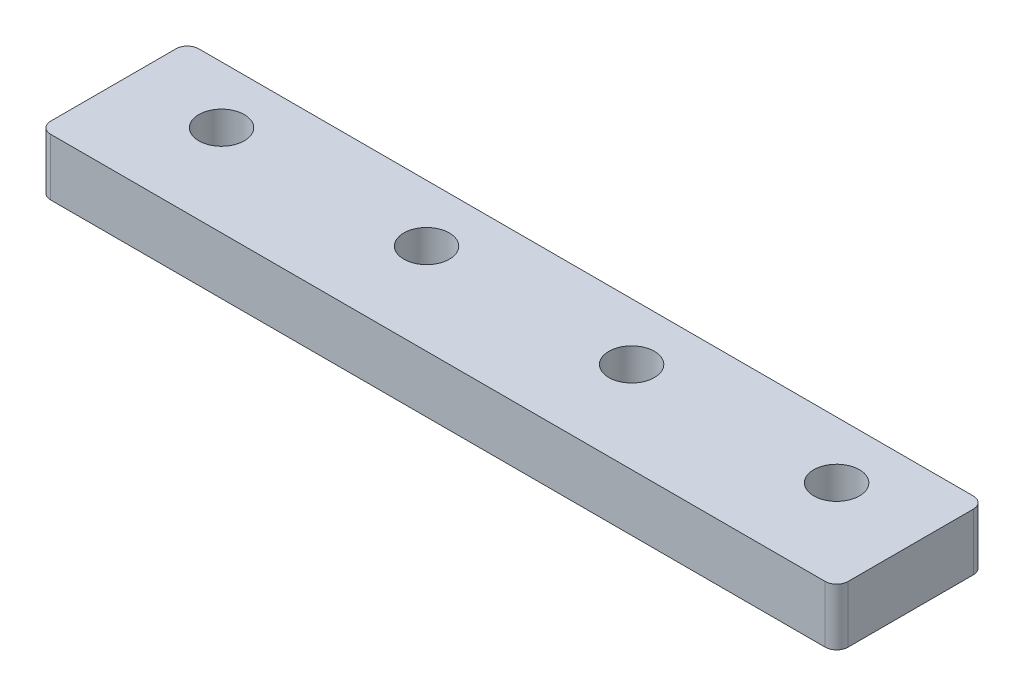
ISO-10303-21;
HEADER;
FILE_DESCRIPTION(('STEP AP214'),'2;1');
FILE_NAME('part.step','',(''),(''),'','','');
FILE_SCHEMA(('AUTOMOTIVE_DESIGN { 1 0 10303 214 1 1 1 1 }'));
ENDSEC;
DATA;
#1=APPLICATION_CONTEXT('core data for automotive mechanical design processes');
#2=APPLICATION_PROTOCOL_DEFINITION('international standard','automotive_design',2000,#1);
#3=PRODUCT_CONTEXT('',#1,'mechanical');
#4=PRODUCT('Part','Part','',(#3));
#5=PRODUCT_RELATED_PRODUCT_CATEGORY('part','',(#4));
#6=PRODUCT_DEFINITION_FORMATION('','',#4);
#7=PRODUCT_DEFINITION_CONTEXT('part definition',#1,'design');
#8=PRODUCT_DEFINITION('design','',#6,#7);
#9=PRODUCT_DEFINITION_SHAPE('','',#8);
#10=(LENGTH_UNIT() NAMED_UNIT(*) SI_UNIT(.MILLI.,.METRE.));
#11=(NAMED_UNIT(*) PLANE_ANGLE_UNIT() SI_UNIT($,.RADIAN.));
#12=(NAMED_UNIT(*) SI_UNIT($,.STERADIAN.) SOLID_ANGLE_UNIT());
#13=UNCERTAINTY_MEASURE_WITH_UNIT(LENGTH_MEASURE(1.E-05),#10,'distance_accuracy_value','');
#14=(GEOMETRIC_REPRESENTATION_CONTEXT(3) GLOBAL_UNCERTAINTY_ASSIGNED_CONTEXT((#13)) GLOBAL_UNIT_ASSIGNED_CONTEXT((#10,
#11,#12)) REPRESENTATION_CONTEXT('',''));
#15=CARTESIAN_POINT('',(0.,0.,0.));
#16=DIRECTION('',(0.,0.,1.));
#17=DIRECTION('',(1.,0.,0.));
#18=AXIS2_PLACEMENT_3D('',#15,#16,#17);
#19=CARTESIAN_POINT('',(0.,5.,0.));
#20=DIRECTION('',(0.,-1.,0.));
#21=DIRECTION('',(0.,0.,-1.));
#22=AXIS2_PLACEMENT_3D('',#19,#20,#21);
#23=PLANE('',#22);
#24=DIRECTION('',(0.,0.,1.));
#25=VECTOR('',#24,1.);
#26=CARTESIAN_POINT('',(-35.,5.,-5.));
#27=LINE('',#26,#25);
#28=CARTESIAN_POINT('',(-35.,5.,-3.99999999999999));
#29=VERTEX_POINT('',#28);
#30=CARTESIAN_POINT('',(-35.,5.,7.00000000000001));
#31=VERTEX_POINT('',#30);
#32=EDGE_CURVE('E180',#29,#31,#27,.T.);
#33=ORIENTED_EDGE('',*,*,#32,.T.);
#34=CARTESIAN_POINT('',(-34.,5.,7.));
#35=DIRECTION('',(0.,-1.,0.));
#36=DIRECTION('',(0.,0.,-1.));
#37=AXIS2_PLACEMENT_3D('',#34,#35,#36);
#38=CIRCLE('',#37,1.);
#39=CARTESIAN_POINT('',(-34.,5.,8.));
#40=VERTEX_POINT('',#39);
#41=EDGE_CURVE('E154',#31,#40,#38,.F.);
#42=ORIENTED_EDGE('',*,*,#41,.T.);
#43=DIRECTION('',(1.,0.,0.));
#44=VECTOR('',#43,1.);
#45=CARTESIAN_POINT('',(-35.,5.,8.));
#46=LINE('',#45,#44);
#47=CARTESIAN_POINT('',(34.,5.,8.));
#48=VERTEX_POINT('',#47);
#49=EDGE_CURVE('E127',#40,#48,#46,.T.);
#50=ORIENTED_EDGE('',*,*,#49,.T.);
#51=CARTESIAN_POINT('',(34.,5.,7.));
#52=DIRECTION('',(0.,-1.,0.));
#53=DIRECTION('',(0.,0.,-1.));
#54=AXIS2_PLACEMENT_3D('',#51,#52,#53);
#55=CIRCLE('',#54,1.);
#56=CARTESIAN_POINT('',(35.,5.,7.));
#57=VERTEX_POINT('',#56);
#58=EDGE_CURVE('E147',#48,#57,#55,.F.);
#59=ORIENTED_EDGE('',*,*,#58,.T.);
#60=DIRECTION('',(0.,0.,-1.));
#61=VECTOR('',#60,1.);
#62=CARTESIAN_POINT('',(35.,5.,8.));
#63=LINE('',#62,#61);
#64=CARTESIAN_POINT('',(34.9999999999999,5.,-4.));
#65=VERTEX_POINT('',#64);
#66=EDGE_CURVE('E132',#57,#65,#63,.T.);
#67=ORIENTED_EDGE('',*,*,#66,.T.);
#68=CARTESIAN_POINT('',(34.,5.,-4.));
#69=DIRECTION('',(0.,-1.,0.));
#70=DIRECTION('',(0.,0.,-1.));
#71=AXIS2_PLACEMENT_3D('',#68,#69,#70);
#72=CIRCLE('',#71,1.);
#73=CARTESIAN_POINT('',(34.,5.,-5.));
#74=VERTEX_POINT('',#73);
#75=EDGE_CURVE('E64',#65,#74,#72,.F.);
#76=ORIENTED_EDGE('',*,*,#75,.T.);
#77=DIRECTION('',(-1.,0.,0.));
#78=VECTOR('',#77,1.);
#79=CARTESIAN_POINT('',(-35.,5.,-5.));
#80=LINE('',#79,#78);
#81=CARTESIAN_POINT('',(-34.0000000000001,5.,-5.));
#82=VERTEX_POINT('',#81);
#83=EDGE_CURVE('E137',#74,#82,#80,.T.);
#84=ORIENTED_EDGE('',*,*,#83,.T.);
#85=CARTESIAN_POINT('',(-34.0000000000001,5.,-4.));
#86=DIRECTION('',(0.,-1.,0.));
#87=DIRECTION('',(0.,0.,-1.));
#88=AXIS2_PLACEMENT_3D('',#85,#86,#87);
#89=CIRCLE('',#88,1.);
#90=EDGE_CURVE('E153',#82,#29,#89,.F.);
#91=ORIENTED_EDGE('',*,*,#90,.T.);
#92=EDGE_LOOP('',(#33,#42,#50,#59,#67,#76,#84,#91));
#93=FACE_BOUND('',#92,.T.);
#94=CARTESIAN_POINT('',(-27.,5.,0.));
#95=DIRECTION('',(0.,1.,0.));
#96=DIRECTION('',(0.,0.,1.));
#97=AXIS2_PLACEMENT_3D('',#94,#95,#96);
#98=CIRCLE('',#97,2.);
#99=CARTESIAN_POINT('',(-27.,5.,2.));
#100=VERTEX_POINT('',#99);
#101=EDGE_CURVE('E173',#100,#100,#98,.T.);
#102=ORIENTED_EDGE('',*,*,#101,.F.);
#103=EDGE_LOOP('',(#102));
#104=FACE_BOUND('',#103,.T.);
#105=CARTESIAN_POINT('',(-8.99999999999999,5.,0.));
#106=DIRECTION('',(0.,1.,0.));
#107=DIRECTION('',(0.,0.,1.));
#108=AXIS2_PLACEMENT_3D('',#105,#106,#107);
#109=CIRCLE('',#108,2.);
#110=CARTESIAN_POINT('',(-8.99999999999999,5.,2.));
#111=VERTEX_POINT('',#110);
#112=EDGE_CURVE('E181',#111,#111,#109,.T.);
#113=ORIENTED_EDGE('',*,*,#112,.F.);
#114=EDGE_LOOP('',(#113));
#115=FACE_BOUND('',#114,.T.);
#116=CARTESIAN_POINT('',(9.00000000000001,5.,0.));
#117=DIRECTION('',(0.,1.,0.));
#118=DIRECTION('',(0.,0.,-1.));
#119=AXIS2_PLACEMENT_3D('',#116,#117,#118);
#120=CIRCLE('',#119,2.);
#121=CARTESIAN_POINT('',(9.00000000000001,5.,-2.));
#122=VERTEX_POINT('',#121);
#123=EDGE_CURVE('E187',#122,#122,#120,.T.);
#124=ORIENTED_EDGE('',*,*,#123,.F.);
#125=EDGE_LOOP('',(#124));
#126=FACE_BOUND('',#125,.T.);
#127=CARTESIAN_POINT('',(27.,5.,0.));
#128=DIRECTION('',(0.,1.,0.));
#129=DIRECTION('',(0.,0.,-1.));
#130=AXIS2_PLACEMENT_3D('',#127,#128,#129);
#131=CIRCLE('',#130,2.);
#132=CARTESIAN_POINT('',(27.,5.,-2.00000000000001));
#133=VERTEX_POINT('',#132);
#134=EDGE_CURVE('E191',#133,#133,#131,.T.);
#135=ORIENTED_EDGE('',*,*,#134,.F.);
#136=EDGE_LOOP('',(#135));
#137=FACE_BOUND('',#136,.T.);
#138=ADVANCED_FACE('F37',(#93,#104,#115,#126,#137),#23,.F.);
#139=CARTESIAN_POINT('',(0.,0.,0.));
#140=DIRECTION('',(0.,-1.,0.));
#141=DIRECTION('',(0.,0.,-1.));
#142=AXIS2_PLACEMENT_3D('',#139,#140,#141);
#143=PLANE('',#142);
#144=CARTESIAN_POINT('',(9.00000000000001,0.,0.));
#145=DIRECTION('',(0.,1.,0.));
#146=DIRECTION('',(0.,0.,-1.));
#147=AXIS2_PLACEMENT_3D('',#144,#145,#146);
#148=CIRCLE('',#147,2.);
#149=CARTESIAN_POINT('',(9.00000000000001,0.,-2.));
#150=VERTEX_POINT('',#149);
#151=EDGE_CURVE('E192',#150,#150,#148,.T.);
#152=ORIENTED_EDGE('',*,*,#151,.T.);
#153=EDGE_LOOP('',(#152));
#154=FACE_BOUND('',#153,.T.);
#155=CARTESIAN_POINT('',(-27.,0.,0.));
#156=DIRECTION('',(0.,1.,0.));
#157=DIRECTION('',(0.,0.,1.));
#158=AXIS2_PLACEMENT_3D('',#155,#156,#157);
#159=CIRCLE('',#158,2.);
#160=CARTESIAN_POINT('',(-27.,0.,2.));
#161=VERTEX_POINT('',#160);
#162=EDGE_CURVE('E175',#161,#161,#159,.T.);
#163=ORIENTED_EDGE('',*,*,#162,.T.);
#164=EDGE_LOOP('',(#163));
#165=FACE_BOUND('',#164,.T.);
#166=DIRECTION('',(1.,0.,0.));
#167=VECTOR('',#166,1.);
#168=CARTESIAN_POINT('',(-35.,0.,8.));
#169=LINE('',#168,#167);
#170=CARTESIAN_POINT('',(-34.,0.,8.));
#171=VERTEX_POINT('',#170);
#172=CARTESIAN_POINT('',(34.,0.,8.));
#173=VERTEX_POINT('',#172);
#174=EDGE_CURVE('E125',#171,#173,#169,.T.);
#175=ORIENTED_EDGE('',*,*,#174,.F.);
#176=CARTESIAN_POINT('',(-34.,0.,7.));
#177=DIRECTION('',(0.,-1.,0.));
#178=DIRECTION('',(0.,0.,-1.));
#179=AXIS2_PLACEMENT_3D('',#176,#177,#178);
#180=CIRCLE('',#179,1.);
#181=CARTESIAN_POINT('',(-35.,0.,7.00000000000001));
#182=VERTEX_POINT('',#181);
#183=EDGE_CURVE('E106',#171,#182,#180,.T.);
#184=ORIENTED_EDGE('',*,*,#183,.T.);
#185=DIRECTION('',(0.,0.,1.));
#186=VECTOR('',#185,1.);
#187=CARTESIAN_POINT('',(-35.,0.,5.));
#188=LINE('',#187,#186);
#189=CARTESIAN_POINT('',(-35.0000000000001,0.,-3.99999999999999));
#190=VERTEX_POINT('',#189);
#191=EDGE_CURVE('E135',#190,#182,#188,.T.);
#192=ORIENTED_EDGE('',*,*,#191,.F.);
#193=CARTESIAN_POINT('',(-34.0000000000001,0.,-4.));
#194=DIRECTION('',(0.,-1.,0.));
#195=DIRECTION('',(0.,0.,-1.));
#196=AXIS2_PLACEMENT_3D('',#193,#194,#195);
#197=CIRCLE('',#196,1.);
#198=CARTESIAN_POINT('',(-34.0000000000001,0.,-5.));
#199=VERTEX_POINT('',#198);
#200=EDGE_CURVE('E119',#190,#199,#197,.T.);
#201=ORIENTED_EDGE('',*,*,#200,.T.);
#202=DIRECTION('',(-1.,0.,0.));
#203=VECTOR('',#202,1.);
#204=CARTESIAN_POINT('',(-35.,0.,-5.));
#205=LINE('',#204,#203);
#206=CARTESIAN_POINT('',(34.,0.,-5.));
#207=VERTEX_POINT('',#206);
#208=EDGE_CURVE('E140',#207,#199,#205,.T.);
#209=ORIENTED_EDGE('',*,*,#208,.F.);
#210=CARTESIAN_POINT('',(34.,0.,-4.));
#211=DIRECTION('',(0.,-1.,0.));
#212=DIRECTION('',(0.,0.,-1.));
#213=AXIS2_PLACEMENT_3D('',#210,#211,#212);
#214=CIRCLE('',#213,1.);
#215=CARTESIAN_POINT('',(35.,0.,-4.));
#216=VERTEX_POINT('',#215);
#217=EDGE_CURVE('E145',#207,#216,#214,.T.);
#218=ORIENTED_EDGE('',*,*,#217,.T.);
#219=DIRECTION('',(0.,0.,-1.));
#220=VECTOR('',#219,1.);
#221=CARTESIAN_POINT('',(35.,0.,-5.));
#222=LINE('',#221,#220);
#223=CARTESIAN_POINT('',(35.,0.,7.));
#224=VERTEX_POINT('',#223);
#225=EDGE_CURVE('E167',#224,#216,#222,.T.);
#226=ORIENTED_EDGE('',*,*,#225,.F.);
#227=CARTESIAN_POINT('',(34.,0.,7.));
#228=DIRECTION('',(0.,-1.,0.));
#229=DIRECTION('',(0.,0.,-1.));
#230=AXIS2_PLACEMENT_3D('',#227,#228,#229);
#231=CIRCLE('',#230,1.);
#232=EDGE_CURVE('E130',#224,#173,#231,.T.);
#233=ORIENTED_EDGE('',*,*,#232,.T.);
#234=EDGE_LOOP('',(#175,#184,#192,#201,#209,#218,#226,#233));
#235=FACE_BOUND('',#234,.T.);
#236=CARTESIAN_POINT('',(-8.99999999999999,0.,0.));
#237=DIRECTION('',(0.,1.,0.));
#238=DIRECTION('',(0.,0.,1.));
#239=AXIS2_PLACEMENT_3D('',#236,#237,#238);
#240=CIRCLE('',#239,2.);
#241=CARTESIAN_POINT('',(-8.99999999999999,0.,2.));
#242=VERTEX_POINT('',#241);
#243=EDGE_CURVE('E183',#242,#242,#240,.T.);
#244=ORIENTED_EDGE('',*,*,#243,.T.);
#245=EDGE_LOOP('',(#244));
#246=FACE_BOUND('',#245,.T.);
#247=CARTESIAN_POINT('',(27.,0.,0.));
#248=DIRECTION('',(0.,1.,0.));
#249=DIRECTION('',(0.,0.,-1.));
#250=AXIS2_PLACEMENT_3D('',#247,#248,#249);
#251=CIRCLE('',#250,2.);
#252=CARTESIAN_POINT('',(27.,0.,-2.00000000000001));
#253=VERTEX_POINT('',#252);
#254=EDGE_CURVE('E197',#253,#253,#251,.T.);
#255=ORIENTED_EDGE('',*,*,#254,.T.);
#256=EDGE_LOOP('',(#255));
#257=FACE_BOUND('',#256,.T.);
#258=ADVANCED_FACE('F128',(#154,#165,#235,#246,#257),#143,.T.);
#259=CARTESIAN_POINT('',(35.,5.,-5.));
#260=DIRECTION('',(-1.,0.,0.));
#261=DIRECTION('',(0.,0.,1.));
#262=AXIS2_PLACEMENT_3D('',#259,#260,#261);
#263=PLANE('',#262);
#264=ORIENTED_EDGE('',*,*,#225,.T.);
#265=DIRECTION('',(0.,-1.,0.));
#266=VECTOR('',#265,1.);
#267=CARTESIAN_POINT('',(35.,5.,-4.));
#268=LINE('',#267,#266);
#269=EDGE_CURVE('E11',#216,#65,#268,.F.);
#270=ORIENTED_EDGE('',*,*,#269,.T.);
#271=ORIENTED_EDGE('',*,*,#66,.F.);
#272=DIRECTION('',(0.,-1.,0.));
#273=VECTOR('',#272,1.);
#274=CARTESIAN_POINT('',(35.,5.,7.));
#275=LINE('',#274,#273);
#276=EDGE_CURVE('E48',#57,#224,#275,.T.);
#277=ORIENTED_EDGE('',*,*,#276,.T.);
#278=EDGE_LOOP('',(#264,#270,#271,#277));
#279=FACE_BOUND('',#278,.T.);
#280=ADVANCED_FACE('F164',(#279),#263,.F.);
#281=CARTESIAN_POINT('',(-35.,5.,-5.));
#282=DIRECTION('',(0.,0.,1.));
#283=DIRECTION('',(1.,0.,0.));
#284=AXIS2_PLACEMENT_3D('',#281,#282,#283);
#285=PLANE('',#284);
#286=ORIENTED_EDGE('',*,*,#208,.T.);
#287=DIRECTION('',(0.,-1.,0.));
#288=VECTOR('',#287,1.);
#289=CARTESIAN_POINT('',(-34.0000000000001,5.,-5.));
#290=LINE('',#289,#288);
#291=EDGE_CURVE('E54',#199,#82,#290,.F.);
#292=ORIENTED_EDGE('',*,*,#291,.T.);
#293=ORIENTED_EDGE('',*,*,#83,.F.);
#294=DIRECTION('',(0.,-1.,0.));
#295=VECTOR('',#294,1.);
#296=CARTESIAN_POINT('',(34.,5.,-5.));
#297=LINE('',#296,#295);
#298=EDGE_CURVE('E160',#74,#207,#297,.T.);
#299=ORIENTED_EDGE('',*,*,#298,.T.);
#300=EDGE_LOOP('',(#286,#292,#293,#299));
#301=FACE_BOUND('',#300,.T.);
#302=ADVANCED_FACE('F221',(#301),#285,.F.);
#303=CARTESIAN_POINT('',(-35.,5.,5.));
#304=DIRECTION('',(1.,0.,0.));
#305=DIRECTION('',(0.,0.,-1.));
#306=AXIS2_PLACEMENT_3D('',#303,#304,#305);
#307=PLANE('',#306);
#308=ORIENTED_EDGE('',*,*,#191,.T.);
#309=DIRECTION('',(0.,-1.,0.));
#310=VECTOR('',#309,1.);
#311=CARTESIAN_POINT('',(-35.,5.,7.00000000000001));
#312=LINE('',#311,#310);
#313=EDGE_CURVE('E112',#182,#31,#312,.F.);
#314=ORIENTED_EDGE('',*,*,#313,.T.);
#315=ORIENTED_EDGE('',*,*,#32,.F.);
#316=DIRECTION('',(0.,-1.,0.));
#317=VECTOR('',#316,1.);
#318=CARTESIAN_POINT('',(-35.0000000000001,5.,-3.99999999999999));
#319=LINE('',#318,#317);
#320=EDGE_CURVE('E118',#29,#190,#319,.T.);
#321=ORIENTED_EDGE('',*,*,#320,.T.);
#322=EDGE_LOOP('',(#308,#314,#315,#321));
#323=FACE_BOUND('',#322,.T.);
#324=ADVANCED_FACE('F222',(#323),#307,.F.);
#325=CARTESIAN_POINT('',(-35.,5.,8.));
#326=DIRECTION('',(0.,0.,-1.));
#327=DIRECTION('',(-1.,0.,0.));
#328=AXIS2_PLACEMENT_3D('',#325,#326,#327);
#329=PLANE('',#328);
#330=ORIENTED_EDGE('',*,*,#49,.F.);
#331=DIRECTION('',(0.,-1.,0.));
#332=VECTOR('',#331,1.);
#333=CARTESIAN_POINT('',(-34.,5.,8.));
#334=LINE('',#333,#332);
#335=EDGE_CURVE('E109',#40,#171,#334,.T.);
#336=ORIENTED_EDGE('',*,*,#335,.T.);
#337=ORIENTED_EDGE('',*,*,#174,.T.);
#338=DIRECTION('',(0.,-1.,0.));
#339=VECTOR('',#338,1.);
#340=CARTESIAN_POINT('',(34.,5.,8.));
#341=LINE('',#340,#339);
#342=EDGE_CURVE('E126',#173,#48,#341,.F.);
#343=ORIENTED_EDGE('',*,*,#342,.T.);
#344=EDGE_LOOP('',(#330,#336,#337,#343));
#345=FACE_BOUND('',#344,.T.);
#346=ADVANCED_FACE('F124',(#345),#329,.F.);
#347=CARTESIAN_POINT('',(-27.,5.,0.));
#348=DIRECTION('',(0.,-1.,0.));
#349=DIRECTION('',(0.,0.,-1.));
#350=AXIS2_PLACEMENT_3D('',#347,#348,#349);
#351=CYLINDRICAL_SURFACE('',#350,2.);
#352=ORIENTED_EDGE('',*,*,#101,.T.);
#353=EDGE_LOOP('',(#352));
#354=FACE_BOUND('',#353,.T.);
#355=ORIENTED_EDGE('',*,*,#162,.F.);
#356=EDGE_LOOP('',(#355));
#357=FACE_BOUND('',#356,.T.);
#358=ADVANCED_FACE('F216',(#354,#357),#351,.F.);
#359=CARTESIAN_POINT('',(-8.99999999999999,5.,0.));
#360=DIRECTION('',(0.,-1.,0.));
#361=DIRECTION('',(0.,0.,-1.));
#362=AXIS2_PLACEMENT_3D('',#359,#360,#361);
#363=CYLINDRICAL_SURFACE('',#362,2.);
#364=ORIENTED_EDGE('',*,*,#112,.T.);
#365=EDGE_LOOP('',(#364));
#366=FACE_BOUND('',#365,.T.);
#367=ORIENTED_EDGE('',*,*,#243,.F.);
#368=EDGE_LOOP('',(#367));
#369=FACE_BOUND('',#368,.T.);
#370=ADVANCED_FACE('F283',(#366,#369),#363,.F.);
#371=CARTESIAN_POINT('',(9.00000000000001,5.,0.));
#372=DIRECTION('',(0.,-1.,0.));
#373=DIRECTION('',(0.,0.,-1.));
#374=AXIS2_PLACEMENT_3D('',#371,#372,#373);
#375=CYLINDRICAL_SURFACE('',#374,2.);
#376=ORIENTED_EDGE('',*,*,#123,.T.);
#377=EDGE_LOOP('',(#376));
#378=FACE_BOUND('',#377,.T.);
#379=ORIENTED_EDGE('',*,*,#151,.F.);
#380=EDGE_LOOP('',(#379));
#381=FACE_BOUND('',#380,.T.);
#382=ADVANCED_FACE('F275',(#378,#381),#375,.F.);
#383=CARTESIAN_POINT('',(27.,5.,0.));
#384=DIRECTION('',(0.,-1.,0.));
#385=DIRECTION('',(0.,0.,-1.));
#386=AXIS2_PLACEMENT_3D('',#383,#384,#385);
#387=CYLINDRICAL_SURFACE('',#386,2.);
#388=ORIENTED_EDGE('',*,*,#134,.T.);
#389=EDGE_LOOP('',(#388));
#390=FACE_BOUND('',#389,.T.);
#391=ORIENTED_EDGE('',*,*,#254,.F.);
#392=EDGE_LOOP('',(#391));
#393=FACE_BOUND('',#392,.T.);
#394=ADVANCED_FACE('F201',(#390,#393),#387,.F.);
#395=CARTESIAN_POINT('',(-34.,5.,7.));
#396=DIRECTION('',(0.,-1.,0.));
#397=DIRECTION('',(0.,0.,-1.));
#398=AXIS2_PLACEMENT_3D('',#395,#396,#397);
#399=CYLINDRICAL_SURFACE('',#398,1.);
#400=ORIENTED_EDGE('',*,*,#41,.F.);
#401=ORIENTED_EDGE('',*,*,#313,.F.);
#402=ORIENTED_EDGE('',*,*,#183,.F.);
#403=ORIENTED_EDGE('',*,*,#335,.F.);
#404=EDGE_LOOP('',(#400,#401,#402,#403));
#405=FACE_BOUND('',#404,.T.);
#406=ADVANCED_FACE('F108',(#405),#399,.T.);
#407=CARTESIAN_POINT('',(-34.0000000000001,5.,-4.));
#408=DIRECTION('',(0.,-1.,0.));
#409=DIRECTION('',(0.,0.,-1.));
#410=AXIS2_PLACEMENT_3D('',#407,#408,#409);
#411=CYLINDRICAL_SURFACE('',#410,1.);
#412=ORIENTED_EDGE('',*,*,#90,.F.);
#413=ORIENTED_EDGE('',*,*,#291,.F.);
#414=ORIENTED_EDGE('',*,*,#200,.F.);
#415=ORIENTED_EDGE('',*,*,#320,.F.);
#416=EDGE_LOOP('',(#412,#413,#414,#415));
#417=FACE_BOUND('',#416,.T.);
#418=ADVANCED_FACE('F234',(#417),#411,.T.);
#419=CARTESIAN_POINT('',(34.,5.,-4.));
#420=DIRECTION('',(0.,-1.,0.));
#421=DIRECTION('',(0.,0.,-1.));
#422=AXIS2_PLACEMENT_3D('',#419,#420,#421);
#423=CYLINDRICAL_SURFACE('',#422,1.);
#424=ORIENTED_EDGE('',*,*,#75,.F.);
#425=ORIENTED_EDGE('',*,*,#269,.F.);
#426=ORIENTED_EDGE('',*,*,#217,.F.);
#427=ORIENTED_EDGE('',*,*,#298,.F.);
#428=EDGE_LOOP('',(#424,#425,#426,#427));
#429=FACE_BOUND('',#428,.T.);
#430=ADVANCED_FACE('F231',(#429),#423,.T.);
#431=CARTESIAN_POINT('',(34.,5.,7.));
#432=DIRECTION('',(0.,-1.,0.));
#433=DIRECTION('',(0.,0.,-1.));
#434=AXIS2_PLACEMENT_3D('',#431,#432,#433);
#435=CYLINDRICAL_SURFACE('',#434,1.);
#436=ORIENTED_EDGE('',*,*,#58,.F.);
#437=ORIENTED_EDGE('',*,*,#342,.F.);
#438=ORIENTED_EDGE('',*,*,#232,.F.);
#439=ORIENTED_EDGE('',*,*,#276,.F.);
#440=EDGE_LOOP('',(#436,#437,#438,#439));
#441=FACE_BOUND('',#440,.T.);
#442=ADVANCED_FACE('F45',(#441),#435,.T.);
#443=CLOSED_SHELL('',(#138,#258,#280,#302,#324,#346,#358,#370,#382,#394,#406,#418,#430,#442));
#444=MANIFOLD_SOLID_BREP('B2',#443);
#445=ADVANCED_BREP_SHAPE_REPRESENTATION('',(#18,#444),#14);
#446=SHAPE_DEFINITION_REPRESENTATION(#9,#445);
ENDSEC;
END-ISO-10303-21;
